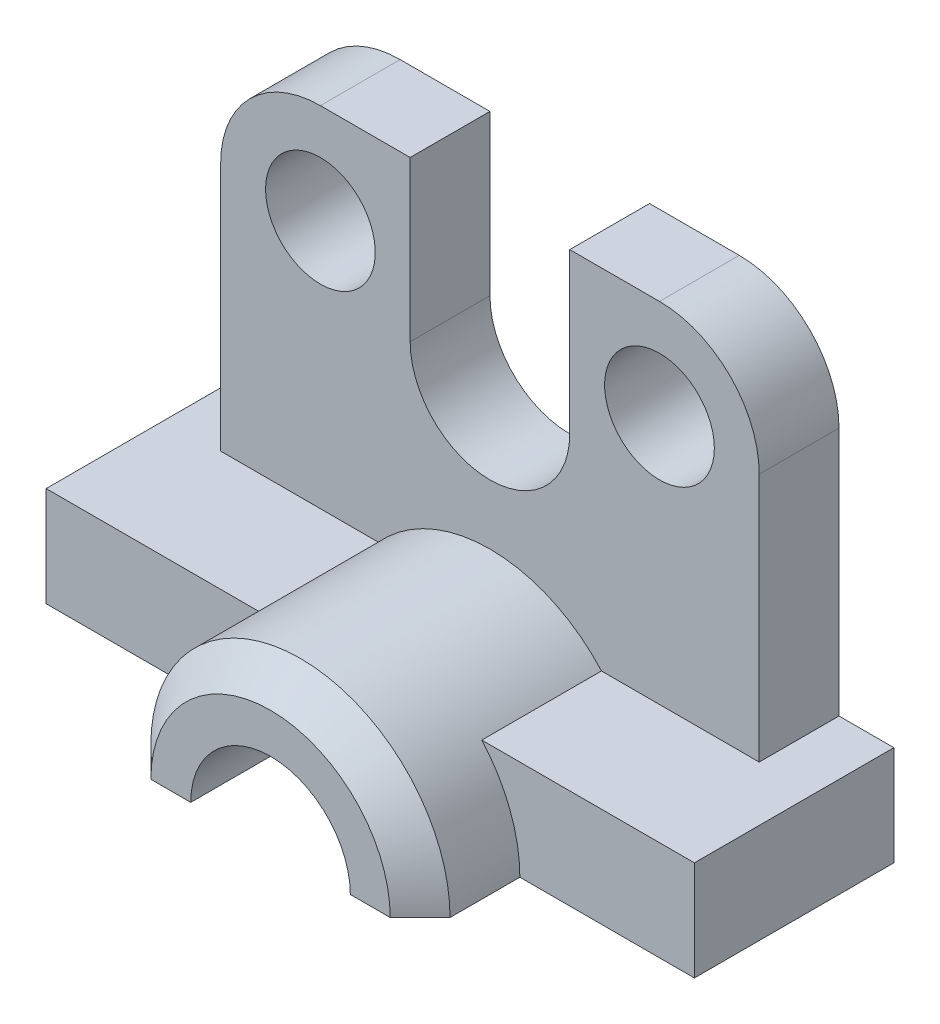
ISO-10303-21;
HEADER;
FILE_DESCRIPTION(('STEP AP214'),'2;1');
FILE_NAME('part.step','',(''),(''),'','','');
FILE_SCHEMA(('AUTOMOTIVE_DESIGN { 1 0 10303 214 1 1 1 1 }'));
ENDSEC;
DATA;
#1=APPLICATION_CONTEXT('core data for automotive mechanical design processes');
#2=APPLICATION_PROTOCOL_DEFINITION('international standard','automotive_design',2000,#1);
#3=PRODUCT_CONTEXT('',#1,'mechanical');
#4=PRODUCT('Part','Part','',(#3));
#5=PRODUCT_RELATED_PRODUCT_CATEGORY('part','',(#4));
#6=PRODUCT_DEFINITION_FORMATION('','',#4);
#7=PRODUCT_DEFINITION_CONTEXT('part definition',#1,'design');
#8=PRODUCT_DEFINITION('design','',#6,#7);
#9=PRODUCT_DEFINITION_SHAPE('','',#8);
#10=(LENGTH_UNIT() NAMED_UNIT(*) SI_UNIT(.MILLI.,.METRE.));
#11=(NAMED_UNIT(*) PLANE_ANGLE_UNIT() SI_UNIT($,.RADIAN.));
#12=(NAMED_UNIT(*) SI_UNIT($,.STERADIAN.) SOLID_ANGLE_UNIT());
#13=UNCERTAINTY_MEASURE_WITH_UNIT(LENGTH_MEASURE(1.E-05),#10,'distance_accuracy_value','');
#14=(GEOMETRIC_REPRESENTATION_CONTEXT(3) GLOBAL_UNCERTAINTY_ASSIGNED_CONTEXT((#13)) GLOBAL_UNIT_ASSIGNED_CONTEXT((#10,
#11,#12)) REPRESENTATION_CONTEXT('',''));
#15=CARTESIAN_POINT('',(0.,0.,0.));
#16=DIRECTION('',(0.,0.,1.));
#17=DIRECTION('',(1.,0.,0.));
#18=AXIS2_PLACEMENT_3D('',#15,#16,#17);
#19=CARTESIAN_POINT('',(0.,0.,30.));
#20=DIRECTION('',(0.,0.,-1.));
#21=DIRECTION('',(-1.,0.,0.));
#22=AXIS2_PLACEMENT_3D('',#19,#20,#21);
#23=PLANE('',#22);
#24=DIRECTION('',(1.,0.,0.));
#25=VECTOR('',#24,1.);
#26=CARTESIAN_POINT('',(7.99999969788877,0.,30.));
#27=LINE('',#26,#25);
#28=CARTESIAN_POINT('',(7.99999969788877,0.,30.));
#29=VERTEX_POINT('',#28);
#30=CARTESIAN_POINT('',(11.9999338015791,0.,30.));
#31=VERTEX_POINT('',#30);
#32=EDGE_CURVE('E281',#29,#31,#27,.T.);
#33=ORIENTED_EDGE('',*,*,#32,.T.);
#34=CARTESIAN_POINT('',(0.,0.,30.));
#35=DIRECTION('',(0.,0.,-1.));
#36=DIRECTION('',(-1.,0.,0.));
#37=AXIS2_PLACEMENT_3D('',#34,#35,#36);
#38=CIRCLE('',#37,11.9999338015791);
#39=CARTESIAN_POINT('',(-11.9999338015791,0.,30.));
#40=VERTEX_POINT('',#39);
#41=EDGE_CURVE('E301',#31,#40,#38,.F.);
#42=ORIENTED_EDGE('',*,*,#41,.T.);
#43=DIRECTION('',(1.,0.,0.));
#44=VECTOR('',#43,1.);
#45=CARTESIAN_POINT('',(-14.9999338015791,0.,30.));
#46=LINE('',#45,#44);
#47=CARTESIAN_POINT('',(-7.99999969788877,0.,30.));
#48=VERTEX_POINT('',#47);
#49=EDGE_CURVE('E273',#40,#48,#46,.T.);
#50=ORIENTED_EDGE('',*,*,#49,.T.);
#51=CARTESIAN_POINT('',(0.,0.,30.));
#52=DIRECTION('',(0.,0.,-1.));
#53=DIRECTION('',(-1.,0.,0.));
#54=AXIS2_PLACEMENT_3D('',#51,#52,#53);
#55=CIRCLE('',#54,7.99999969788877);
#56=EDGE_CURVE('E278',#48,#29,#55,.T.);
#57=ORIENTED_EDGE('',*,*,#56,.T.);
#58=EDGE_LOOP('',(#33,#42,#50,#57));
#59=FACE_BOUND('',#58,.T.);
#60=ADVANCED_FACE('F47',(#59),#23,.F.);
#61=CARTESIAN_POINT('',(-14.9999338015791,0.,30.));
#62=DIRECTION('',(0.,1.,0.));
#63=DIRECTION('',(0.,0.,1.));
#64=AXIS2_PLACEMENT_3D('',#61,#62,#63);
#65=PLANE('',#64);
#66=ORIENTED_EDGE('',*,*,#49,.F.);
#67=DIRECTION('',(0.707106781186546,0.,0.707106781186549));
#68=VECTOR('',#67,1.);
#69=CARTESIAN_POINT('',(0.,0.,41.9999338015792));
#70=LINE('',#69,#68);
#71=CARTESIAN_POINT('',(-14.9999338015791,0.,27.));
#72=VERTEX_POINT('',#71);
#73=EDGE_CURVE('E305',#40,#72,#70,.F.);
#74=ORIENTED_EDGE('',*,*,#73,.T.);
#75=DIRECTION('',(0.,0.,-1.));
#76=VECTOR('',#75,1.);
#77=CARTESIAN_POINT('',(-14.9999338015791,0.,30.));
#78=LINE('',#77,#76);
#79=CARTESIAN_POINT('',(-14.9999338015791,0.,20.));
#80=VERTEX_POINT('',#79);
#81=EDGE_CURVE('E295',#72,#80,#78,.T.);
#82=ORIENTED_EDGE('',*,*,#81,.T.);
#83=DIRECTION('',(1.,0.,0.));
#84=VECTOR('',#83,1.);
#85=CARTESIAN_POINT('',(-32.5,0.,20.));
#86=LINE('',#85,#84);
#87=CARTESIAN_POINT('',(-32.5,0.,20.));
#88=VERTEX_POINT('',#87);
#89=EDGE_CURVE('E258',#88,#80,#86,.T.);
#90=ORIENTED_EDGE('',*,*,#89,.F.);
#91=DIRECTION('',(0.,0.,1.));
#92=VECTOR('',#91,1.);
#93=CARTESIAN_POINT('',(-32.5,0.,0.));
#94=LINE('',#93,#92);
#95=CARTESIAN_POINT('',(-32.5,0.,0.));
#96=VERTEX_POINT('',#95);
#97=EDGE_CURVE('E254',#96,#88,#94,.T.);
#98=ORIENTED_EDGE('',*,*,#97,.F.);
#99=DIRECTION('',(-1.,0.,0.));
#100=VECTOR('',#99,1.);
#101=CARTESIAN_POINT('',(-32.5,0.,0.));
#102=LINE('',#101,#100);
#103=CARTESIAN_POINT('',(-7.99999969788877,0.,0.));
#104=VERTEX_POINT('',#103);
#105=EDGE_CURVE('E257',#104,#96,#102,.T.);
#106=ORIENTED_EDGE('',*,*,#105,.F.);
#107=DIRECTION('',(0.,0.,-1.));
#108=VECTOR('',#107,1.);
#109=CARTESIAN_POINT('',(-7.99999969788877,0.,30.));
#110=LINE('',#109,#108);
#111=EDGE_CURVE('E292',#48,#104,#110,.T.);
#112=ORIENTED_EDGE('',*,*,#111,.F.);
#113=EDGE_LOOP('',(#66,#74,#82,#90,#98,#106,#112));
#114=FACE_BOUND('',#113,.T.);
#115=ADVANCED_FACE('F465',(#114),#65,.F.);
#116=CARTESIAN_POINT('',(0.,0.,0.));
#117=DIRECTION('',(0.,0.,-1.));
#118=DIRECTION('',(-1.,0.,0.));
#119=AXIS2_PLACEMENT_3D('',#116,#117,#118);
#120=PLANE('',#119);
#121=DIRECTION('',(-1.,0.,0.));
#122=VECTOR('',#121,1.);
#123=CARTESIAN_POINT('',(-32.5,10.,0.));
#124=LINE('',#123,#122);
#125=CARTESIAN_POINT('',(-27.,10.,0.));
#126=VERTEX_POINT('',#125);
#127=CARTESIAN_POINT('',(-32.5,10.,0.));
#128=VERTEX_POINT('',#127);
#129=EDGE_CURVE('E262',#126,#128,#124,.T.);
#130=ORIENTED_EDGE('',*,*,#129,.F.);
#131=DIRECTION('',(0.,-1.,0.));
#132=VECTOR('',#131,1.);
#133=CARTESIAN_POINT('',(-27.,10.,0.));
#134=LINE('',#133,#132);
#135=CARTESIAN_POINT('',(-27.,35.,0.));
#136=VERTEX_POINT('',#135);
#137=EDGE_CURVE('E202',#136,#126,#134,.T.);
#138=ORIENTED_EDGE('',*,*,#137,.F.);
#139=CARTESIAN_POINT('',(-17.,35.,0.));
#140=DIRECTION('',(0.,0.,1.));
#141=DIRECTION('',(-1.,0.,0.));
#142=AXIS2_PLACEMENT_3D('',#139,#140,#141);
#143=CIRCLE('',#142,10.);
#144=CARTESIAN_POINT('',(-17.,45.,0.));
#145=VERTEX_POINT('',#144);
#146=EDGE_CURVE('E362',#145,#136,#143,.T.);
#147=ORIENTED_EDGE('',*,*,#146,.F.);
#148=DIRECTION('',(-1.,0.,0.));
#149=VECTOR('',#148,1.);
#150=CARTESIAN_POINT('',(-17.,45.,0.));
#151=LINE('',#150,#149);
#152=CARTESIAN_POINT('',(-8.,45.,0.));
#153=VERTEX_POINT('',#152);
#154=EDGE_CURVE('E365',#153,#145,#151,.T.);
#155=ORIENTED_EDGE('',*,*,#154,.F.);
#156=DIRECTION('',(0.,1.,0.));
#157=VECTOR('',#156,1.);
#158=CARTESIAN_POINT('',(-8.,45.,0.));
#159=LINE('',#158,#157);
#160=CARTESIAN_POINT('',(-8.,29.,0.));
#161=VERTEX_POINT('',#160);
#162=EDGE_CURVE('E368',#161,#153,#159,.T.);
#163=ORIENTED_EDGE('',*,*,#162,.F.);
#164=CARTESIAN_POINT('',(0.,29.,0.));
#165=DIRECTION('',(0.,0.,-1.));
#166=DIRECTION('',(1.,0.,0.));
#167=AXIS2_PLACEMENT_3D('',#164,#165,#166);
#168=CIRCLE('',#167,8.);
#169=CARTESIAN_POINT('',(8.,29.,0.));
#170=VERTEX_POINT('',#169);
#171=EDGE_CURVE('E371',#170,#161,#168,.T.);
#172=ORIENTED_EDGE('',*,*,#171,.F.);
#173=DIRECTION('',(0.,-1.,0.));
#174=VECTOR('',#173,1.);
#175=CARTESIAN_POINT('',(8.,45.,0.));
#176=LINE('',#175,#174);
#177=CARTESIAN_POINT('',(8.,45.,0.));
#178=VERTEX_POINT('',#177);
#179=EDGE_CURVE('E374',#178,#170,#176,.T.);
#180=ORIENTED_EDGE('',*,*,#179,.F.);
#181=DIRECTION('',(-1.,0.,0.));
#182=VECTOR('',#181,1.);
#183=CARTESIAN_POINT('',(17.,45.,0.));
#184=LINE('',#183,#182);
#185=CARTESIAN_POINT('',(17.,45.,0.));
#186=VERTEX_POINT('',#185);
#187=EDGE_CURVE('E377',#186,#178,#184,.T.);
#188=ORIENTED_EDGE('',*,*,#187,.F.);
#189=CARTESIAN_POINT('',(17.,35.,0.));
#190=DIRECTION('',(0.,0.,1.));
#191=DIRECTION('',(1.,0.,0.));
#192=AXIS2_PLACEMENT_3D('',#189,#190,#191);
#193=CIRCLE('',#192,10.);
#194=CARTESIAN_POINT('',(27.,35.,0.));
#195=VERTEX_POINT('',#194);
#196=EDGE_CURVE('E380',#195,#186,#193,.T.);
#197=ORIENTED_EDGE('',*,*,#196,.F.);
#198=DIRECTION('',(0.,1.,0.));
#199=VECTOR('',#198,1.);
#200=CARTESIAN_POINT('',(27.,10.,0.));
#201=LINE('',#200,#199);
#202=CARTESIAN_POINT('',(27.,10.,0.));
#203=VERTEX_POINT('',#202);
#204=EDGE_CURVE('E383',#203,#195,#201,.T.);
#205=ORIENTED_EDGE('',*,*,#204,.F.);
#206=DIRECTION('',(-1.,0.,0.));
#207=VECTOR('',#206,1.);
#208=CARTESIAN_POINT('',(-32.5,10.,0.));
#209=LINE('',#208,#207);
#210=CARTESIAN_POINT('',(32.5,10.,0.));
#211=VERTEX_POINT('',#210);
#212=EDGE_CURVE('E236',#211,#203,#209,.T.);
#213=ORIENTED_EDGE('',*,*,#212,.F.);
#214=DIRECTION('',(0.,-1.,0.));
#215=VECTOR('',#214,1.);
#216=CARTESIAN_POINT('',(32.5,10.,0.));
#217=LINE('',#216,#215);
#218=CARTESIAN_POINT('',(32.5,0.,0.));
#219=VERTEX_POINT('',#218);
#220=EDGE_CURVE('E217',#211,#219,#217,.T.);
#221=ORIENTED_EDGE('',*,*,#220,.T.);
#222=DIRECTION('',(-1.,0.,0.));
#223=VECTOR('',#222,1.);
#224=CARTESIAN_POINT('',(-32.5,0.,0.));
#225=LINE('',#224,#223);
#226=CARTESIAN_POINT('',(7.99999969788877,0.,0.));
#227=VERTEX_POINT('',#226);
#228=EDGE_CURVE('E231',#219,#227,#225,.T.);
#229=ORIENTED_EDGE('',*,*,#228,.T.);
#230=CARTESIAN_POINT('',(0.,0.,0.));
#231=DIRECTION('',(0.,0.,-1.));
#232=DIRECTION('',(-1.,0.,0.));
#233=AXIS2_PLACEMENT_3D('',#230,#231,#232);
#234=CIRCLE('',#233,7.99999969788877);
#235=EDGE_CURVE('E218',#104,#227,#234,.T.);
#236=ORIENTED_EDGE('',*,*,#235,.F.);
#237=ORIENTED_EDGE('',*,*,#105,.T.);
#238=DIRECTION('',(0.,-1.,0.));
#239=VECTOR('',#238,1.);
#240=CARTESIAN_POINT('',(-32.5,10.,0.));
#241=LINE('',#240,#239);
#242=EDGE_CURVE('E244',#128,#96,#241,.T.);
#243=ORIENTED_EDGE('',*,*,#242,.F.);
#244=EDGE_LOOP('',(#130,#138,#147,#155,#163,#172,#180,#188,#197,#205,#213,#221,#229,#236,#237,#243));
#245=FACE_BOUND('',#244,.T.);
#246=CARTESIAN_POINT('',(17.,35.,0.));
#247=DIRECTION('',(0.,0.,1.));
#248=DIRECTION('',(1.,0.,0.));
#249=AXIS2_PLACEMENT_3D('',#246,#247,#248);
#250=CIRCLE('',#249,5.5);
#251=CARTESIAN_POINT('',(22.5,35.,0.));
#252=VERTEX_POINT('',#251);
#253=EDGE_CURVE('E415',#252,#252,#250,.T.);
#254=ORIENTED_EDGE('',*,*,#253,.T.);
#255=EDGE_LOOP('',(#254));
#256=FACE_BOUND('',#255,.T.);
#257=CARTESIAN_POINT('',(-17.,35.,0.));
#258=DIRECTION('',(0.,0.,1.));
#259=DIRECTION('',(-1.,0.,0.));
#260=AXIS2_PLACEMENT_3D('',#257,#258,#259);
#261=CIRCLE('',#260,5.5);
#262=CARTESIAN_POINT('',(-22.5,35.,0.));
#263=VERTEX_POINT('',#262);
#264=EDGE_CURVE('E423',#263,#263,#261,.T.);
#265=ORIENTED_EDGE('',*,*,#264,.T.);
#266=EDGE_LOOP('',(#265));
#267=FACE_BOUND('',#266,.T.);
#268=ADVANCED_FACE('F467',(#245,#256,#267),#120,.T.);
#269=CARTESIAN_POINT('',(7.99999969788877,0.,30.));
#270=DIRECTION('',(0.,1.,0.));
#271=DIRECTION('',(0.,0.,1.));
#272=AXIS2_PLACEMENT_3D('',#269,#270,#271);
#273=PLANE('',#272);
#274=DIRECTION('',(0.,0.,-1.));
#275=VECTOR('',#274,1.);
#276=CARTESIAN_POINT('',(14.9999338015791,0.,30.));
#277=LINE('',#276,#275);
#278=CARTESIAN_POINT('',(14.9999338015791,0.,27.));
#279=VERTEX_POINT('',#278);
#280=CARTESIAN_POINT('',(14.9999338015791,0.,20.));
#281=VERTEX_POINT('',#280);
#282=EDGE_CURVE('E285',#279,#281,#277,.T.);
#283=ORIENTED_EDGE('',*,*,#282,.F.);
#284=DIRECTION('',(0.707106781186546,0.,-0.707106781186549));
#285=VECTOR('',#284,1.);
#286=CARTESIAN_POINT('',(0.,0.,41.9999338015792));
#287=LINE('',#286,#285);
#288=EDGE_CURVE('E11',#279,#31,#287,.F.);
#289=ORIENTED_EDGE('',*,*,#288,.T.);
#290=ORIENTED_EDGE('',*,*,#32,.F.);
#291=DIRECTION('',(0.,0.,-1.));
#292=VECTOR('',#291,1.);
#293=CARTESIAN_POINT('',(7.99999969788877,0.,30.));
#294=LINE('',#293,#292);
#295=EDGE_CURVE('E288',#29,#227,#294,.T.);
#296=ORIENTED_EDGE('',*,*,#295,.T.);
#297=ORIENTED_EDGE('',*,*,#228,.F.);
#298=DIRECTION('',(0.,0.,-1.));
#299=VECTOR('',#298,1.);
#300=CARTESIAN_POINT('',(32.5,0.,0.));
#301=LINE('',#300,#299);
#302=CARTESIAN_POINT('',(32.5,0.,20.));
#303=VERTEX_POINT('',#302);
#304=EDGE_CURVE('E234',#303,#219,#301,.T.);
#305=ORIENTED_EDGE('',*,*,#304,.F.);
#306=DIRECTION('',(1.,0.,0.));
#307=VECTOR('',#306,1.);
#308=CARTESIAN_POINT('',(-32.5,0.,20.));
#309=LINE('',#308,#307);
#310=EDGE_CURVE('E235',#281,#303,#309,.T.);
#311=ORIENTED_EDGE('',*,*,#310,.F.);
#312=EDGE_LOOP('',(#283,#289,#290,#296,#297,#305,#311));
#313=FACE_BOUND('',#312,.T.);
#314=ADVANCED_FACE('F461',(#313),#273,.F.);
#315=CARTESIAN_POINT('',(0.,0.,30.));
#316=DIRECTION('',(0.,0.,-1.));
#317=DIRECTION('',(-1.,0.,0.));
#318=AXIS2_PLACEMENT_3D('',#315,#316,#317);
#319=CYLINDRICAL_SURFACE('',#318,14.9999338015791);
#320=DIRECTION('',(0.,0.,-1.));
#321=VECTOR('',#320,1.);
#322=CARTESIAN_POINT('',(11.1802510728407,10.,30.));
#323=LINE('',#322,#321);
#324=CARTESIAN_POINT('',(11.1802510728407,10.,8.));
#325=VERTEX_POINT('',#324);
#326=CARTESIAN_POINT('',(11.1802510728407,10.,20.));
#327=VERTEX_POINT('',#326);
#328=EDGE_CURVE('E206',#325,#327,#323,.F.);
#329=ORIENTED_EDGE('',*,*,#328,.F.);
#330=CARTESIAN_POINT('',(0.,0.,8.));
#331=DIRECTION('',(0.,0.,-1.));
#332=DIRECTION('',(1.,0.,0.));
#333=AXIS2_PLACEMENT_3D('',#330,#331,#332);
#334=CIRCLE('',#333,14.9999338015791);
#335=CARTESIAN_POINT('',(-11.1802510728408,9.99999999999992,8.));
#336=VERTEX_POINT('',#335);
#337=EDGE_CURVE('E190',#336,#325,#334,.T.);
#338=ORIENTED_EDGE('',*,*,#337,.F.);
#339=DIRECTION('',(0.,0.,-1.));
#340=VECTOR('',#339,1.);
#341=CARTESIAN_POINT('',(-11.1802510728407,10.,30.));
#342=LINE('',#341,#340);
#343=CARTESIAN_POINT('',(-11.1802510728407,10.,20.));
#344=VERTEX_POINT('',#343);
#345=EDGE_CURVE('E249',#344,#336,#342,.T.);
#346=ORIENTED_EDGE('',*,*,#345,.F.);
#347=CARTESIAN_POINT('',(0.,0.,20.));
#348=DIRECTION('',(0.,0.,-1.));
#349=DIRECTION('',(-1.,0.,0.));
#350=AXIS2_PLACEMENT_3D('',#347,#348,#349);
#351=CIRCLE('',#350,14.9999338015791);
#352=EDGE_CURVE('E298',#344,#80,#351,.F.);
#353=ORIENTED_EDGE('',*,*,#352,.T.);
#354=ORIENTED_EDGE('',*,*,#81,.F.);
#355=CARTESIAN_POINT('',(0.,0.,27.));
#356=DIRECTION('',(0.,0.,-1.));
#357=DIRECTION('',(-1.,0.,0.));
#358=AXIS2_PLACEMENT_3D('',#355,#356,#357);
#359=CIRCLE('',#358,14.9999338015791);
#360=EDGE_CURVE('E57',#72,#279,#359,.T.);
#361=ORIENTED_EDGE('',*,*,#360,.T.);
#362=ORIENTED_EDGE('',*,*,#282,.T.);
#363=EDGE_CURVE('E215',#281,#327,#351,.F.);
#364=ORIENTED_EDGE('',*,*,#363,.T.);
#365=EDGE_LOOP('',(#329,#338,#346,#353,#354,#361,#362,#364));
#366=FACE_BOUND('',#365,.T.);
#367=ADVANCED_FACE('F213',(#366),#319,.T.);
#368=CARTESIAN_POINT('',(0.,0.,30.));
#369=DIRECTION('',(0.,0.,-1.));
#370=DIRECTION('',(-1.,0.,0.));
#371=AXIS2_PLACEMENT_3D('',#368,#369,#370);
#372=CYLINDRICAL_SURFACE('',#371,7.99999969788877);
#373=ORIENTED_EDGE('',*,*,#111,.T.);
#374=ORIENTED_EDGE('',*,*,#235,.T.);
#375=ORIENTED_EDGE('',*,*,#295,.F.);
#376=ORIENTED_EDGE('',*,*,#56,.F.);
#377=EDGE_LOOP('',(#373,#374,#375,#376));
#378=FACE_BOUND('',#377,.T.);
#379=ADVANCED_FACE('F449',(#378),#372,.F.);
#380=CARTESIAN_POINT('',(-32.5,10.,0.));
#381=DIRECTION('',(1.,0.,0.));
#382=DIRECTION('',(0.,0.,-1.));
#383=AXIS2_PLACEMENT_3D('',#380,#381,#382);
#384=PLANE('',#383);
#385=ORIENTED_EDGE('',*,*,#97,.T.);
#386=DIRECTION('',(0.,-1.,0.));
#387=VECTOR('',#386,1.);
#388=CARTESIAN_POINT('',(-32.5,10.,20.));
#389=LINE('',#388,#387);
#390=CARTESIAN_POINT('',(-32.5,10.,20.));
#391=VERTEX_POINT('',#390);
#392=EDGE_CURVE('E248',#391,#88,#389,.T.);
#393=ORIENTED_EDGE('',*,*,#392,.F.);
#394=DIRECTION('',(0.,0.,1.));
#395=VECTOR('',#394,1.);
#396=CARTESIAN_POINT('',(-32.5,10.,0.));
#397=LINE('',#396,#395);
#398=EDGE_CURVE('E259',#128,#391,#397,.T.);
#399=ORIENTED_EDGE('',*,*,#398,.F.);
#400=ORIENTED_EDGE('',*,*,#242,.T.);
#401=EDGE_LOOP('',(#385,#393,#399,#400));
#402=FACE_BOUND('',#401,.T.);
#403=ADVANCED_FACE('F451',(#402),#384,.F.);
#404=CARTESIAN_POINT('',(-32.5,10.,20.));
#405=DIRECTION('',(0.,0.,-1.));
#406=DIRECTION('',(-1.,0.,0.));
#407=AXIS2_PLACEMENT_3D('',#404,#405,#406);
#408=PLANE('',#407);
#409=ORIENTED_EDGE('',*,*,#352,.F.);
#410=DIRECTION('',(1.,0.,0.));
#411=VECTOR('',#410,1.);
#412=CARTESIAN_POINT('',(-32.5,10.,20.));
#413=LINE('',#412,#411);
#414=EDGE_CURVE('E253',#391,#344,#413,.T.);
#415=ORIENTED_EDGE('',*,*,#414,.F.);
#416=ORIENTED_EDGE('',*,*,#392,.T.);
#417=ORIENTED_EDGE('',*,*,#89,.T.);
#418=EDGE_LOOP('',(#409,#415,#416,#417));
#419=FACE_BOUND('',#418,.T.);
#420=ADVANCED_FACE('F457',(#419),#408,.F.);
#421=CARTESIAN_POINT('',(0.,10.,0.));
#422=DIRECTION('',(0.,1.,0.));
#423=DIRECTION('',(0.,0.,1.));
#424=AXIS2_PLACEMENT_3D('',#421,#422,#423);
#425=PLANE('',#424);
#426=DIRECTION('',(1.,0.,0.));
#427=VECTOR('',#426,1.);
#428=CARTESIAN_POINT('',(-11.1802510728408,9.99999999999992,8.));
#429=LINE('',#428,#427);
#430=CARTESIAN_POINT('',(-27.,10.,8.));
#431=VERTEX_POINT('',#430);
#432=EDGE_CURVE('E197',#431,#336,#429,.T.);
#433=ORIENTED_EDGE('',*,*,#432,.F.);
#434=DIRECTION('',(0.,0.,-1.));
#435=VECTOR('',#434,1.);
#436=CARTESIAN_POINT('',(-27.,10.,8.));
#437=LINE('',#436,#435);
#438=EDGE_CURVE('E356',#431,#126,#437,.T.);
#439=ORIENTED_EDGE('',*,*,#438,.T.);
#440=ORIENTED_EDGE('',*,*,#129,.T.);
#441=ORIENTED_EDGE('',*,*,#398,.T.);
#442=ORIENTED_EDGE('',*,*,#414,.T.);
#443=ORIENTED_EDGE('',*,*,#345,.T.);
#444=EDGE_LOOP('',(#433,#439,#440,#441,#442,#443));
#445=FACE_BOUND('',#444,.T.);
#446=ADVANCED_FACE('F477',(#445),#425,.T.);
#447=CARTESIAN_POINT('',(32.5,10.,0.));
#448=DIRECTION('',(-1.,0.,0.));
#449=DIRECTION('',(0.,0.,1.));
#450=AXIS2_PLACEMENT_3D('',#447,#448,#449);
#451=PLANE('',#450);
#452=ORIENTED_EDGE('',*,*,#304,.T.);
#453=ORIENTED_EDGE('',*,*,#220,.F.);
#454=DIRECTION('',(0.,0.,-1.));
#455=VECTOR('',#454,1.);
#456=CARTESIAN_POINT('',(32.5,10.,0.));
#457=LINE('',#456,#455);
#458=CARTESIAN_POINT('',(32.5,10.,20.));
#459=VERTEX_POINT('',#458);
#460=EDGE_CURVE('E229',#459,#211,#457,.T.);
#461=ORIENTED_EDGE('',*,*,#460,.F.);
#462=DIRECTION('',(0.,-1.,0.));
#463=VECTOR('',#462,1.);
#464=CARTESIAN_POINT('',(32.5,10.,20.));
#465=LINE('',#464,#463);
#466=EDGE_CURVE('E223',#459,#303,#465,.T.);
#467=ORIENTED_EDGE('',*,*,#466,.T.);
#468=EDGE_LOOP('',(#452,#453,#461,#467));
#469=FACE_BOUND('',#468,.T.);
#470=ADVANCED_FACE('F445',(#469),#451,.F.);
#471=CARTESIAN_POINT('',(-32.5,10.,20.));
#472=DIRECTION('',(0.,0.,-1.));
#473=DIRECTION('',(-1.,0.,0.));
#474=AXIS2_PLACEMENT_3D('',#471,#472,#473);
#475=PLANE('',#474);
#476=ORIENTED_EDGE('',*,*,#363,.F.);
#477=ORIENTED_EDGE('',*,*,#310,.T.);
#478=ORIENTED_EDGE('',*,*,#466,.F.);
#479=DIRECTION('',(1.,0.,0.));
#480=VECTOR('',#479,1.);
#481=CARTESIAN_POINT('',(-32.5,10.,20.));
#482=LINE('',#481,#480);
#483=EDGE_CURVE('E239',#327,#459,#482,.T.);
#484=ORIENTED_EDGE('',*,*,#483,.F.);
#485=EDGE_LOOP('',(#476,#477,#478,#484));
#486=FACE_BOUND('',#485,.T.);
#487=ADVANCED_FACE('F489',(#486),#475,.F.);
#488=CARTESIAN_POINT('',(0.,10.,0.));
#489=DIRECTION('',(0.,1.,0.));
#490=DIRECTION('',(0.,0.,1.));
#491=AXIS2_PLACEMENT_3D('',#488,#489,#490);
#492=PLANE('',#491);
#493=DIRECTION('',(1.,0.,0.));
#494=VECTOR('',#493,1.);
#495=CARTESIAN_POINT('',(11.1802510728407,10.,8.));
#496=LINE('',#495,#494);
#497=CARTESIAN_POINT('',(27.,10.,8.));
#498=VERTEX_POINT('',#497);
#499=EDGE_CURVE('E194',#325,#498,#496,.T.);
#500=ORIENTED_EDGE('',*,*,#499,.F.);
#501=ORIENTED_EDGE('',*,*,#328,.T.);
#502=ORIENTED_EDGE('',*,*,#483,.T.);
#503=ORIENTED_EDGE('',*,*,#460,.T.);
#504=ORIENTED_EDGE('',*,*,#212,.T.);
#505=DIRECTION('',(0.,0.,-1.));
#506=VECTOR('',#505,1.);
#507=CARTESIAN_POINT('',(27.,10.,8.));
#508=LINE('',#507,#506);
#509=EDGE_CURVE('E209',#498,#203,#508,.T.);
#510=ORIENTED_EDGE('',*,*,#509,.F.);
#511=EDGE_LOOP('',(#500,#501,#502,#503,#504,#510));
#512=FACE_BOUND('',#511,.T.);
#513=ADVANCED_FACE('F205',(#512),#492,.T.);
#514=CARTESIAN_POINT('',(0.,0.,30.));
#515=DIRECTION('',(0.,0.,-1.));
#516=DIRECTION('',(-1.,0.,0.));
#517=AXIS2_PLACEMENT_3D('',#514,#515,#516);
#518=CONICAL_SURFACE('',#517,11.9999338015791,0.785398163397446);
#519=ORIENTED_EDGE('',*,*,#288,.F.);
#520=ORIENTED_EDGE('',*,*,#360,.F.);
#521=ORIENTED_EDGE('',*,*,#73,.F.);
#522=ORIENTED_EDGE('',*,*,#41,.F.);
#523=EDGE_LOOP('',(#519,#520,#521,#522));
#524=FACE_BOUND('',#523,.T.);
#525=ADVANCED_FACE('F50',(#524),#518,.T.);
#526=CARTESIAN_POINT('',(0.,0.,8.));
#527=DIRECTION('',(0.,0.,1.));
#528=DIRECTION('',(1.,0.,0.));
#529=AXIS2_PLACEMENT_3D('',#526,#527,#528);
#530=PLANE('',#529);
#531=CARTESIAN_POINT('',(17.,35.,8.));
#532=DIRECTION('',(0.,0.,1.));
#533=DIRECTION('',(1.,0.,0.));
#534=AXIS2_PLACEMENT_3D('',#531,#532,#533);
#535=CIRCLE('',#534,5.5);
#536=CARTESIAN_POINT('',(22.5,35.,8.));
#537=VERTEX_POINT('',#536);
#538=EDGE_CURVE('E386',#537,#537,#535,.T.);
#539=ORIENTED_EDGE('',*,*,#538,.F.);
#540=EDGE_LOOP('',(#539));
#541=FACE_BOUND('',#540,.T.);
#542=ORIENTED_EDGE('',*,*,#337,.T.);
#543=ORIENTED_EDGE('',*,*,#499,.T.);
#544=DIRECTION('',(0.,1.,0.));
#545=VECTOR('',#544,1.);
#546=CARTESIAN_POINT('',(27.,10.,8.));
#547=LINE('',#546,#545);
#548=CARTESIAN_POINT('',(27.,35.,8.));
#549=VERTEX_POINT('',#548);
#550=EDGE_CURVE('E64',#498,#549,#547,.T.);
#551=ORIENTED_EDGE('',*,*,#550,.T.);
#552=CARTESIAN_POINT('',(17.,35.,8.));
#553=DIRECTION('',(0.,0.,1.));
#554=DIRECTION('',(1.,0.,0.));
#555=AXIS2_PLACEMENT_3D('',#552,#553,#554);
#556=CIRCLE('',#555,10.);
#557=CARTESIAN_POINT('',(17.,45.,8.));
#558=VERTEX_POINT('',#557);
#559=EDGE_CURVE('E410',#549,#558,#556,.T.);
#560=ORIENTED_EDGE('',*,*,#559,.T.);
#561=DIRECTION('',(-1.,0.,0.));
#562=VECTOR('',#561,1.);
#563=CARTESIAN_POINT('',(17.,45.,8.));
#564=LINE('',#563,#562);
#565=CARTESIAN_POINT('',(8.,45.,8.));
#566=VERTEX_POINT('',#565);
#567=EDGE_CURVE('E407',#558,#566,#564,.T.);
#568=ORIENTED_EDGE('',*,*,#567,.T.);
#569=DIRECTION('',(0.,-1.,0.));
#570=VECTOR('',#569,1.);
#571=CARTESIAN_POINT('',(8.,45.,8.));
#572=LINE('',#571,#570);
#573=CARTESIAN_POINT('',(8.,29.,8.));
#574=VERTEX_POINT('',#573);
#575=EDGE_CURVE('E404',#566,#574,#572,.T.);
#576=ORIENTED_EDGE('',*,*,#575,.T.);
#577=CARTESIAN_POINT('',(0.,29.,8.));
#578=DIRECTION('',(0.,0.,-1.));
#579=DIRECTION('',(1.,0.,0.));
#580=AXIS2_PLACEMENT_3D('',#577,#578,#579);
#581=CIRCLE('',#580,8.);
#582=CARTESIAN_POINT('',(-8.,29.,8.));
#583=VERTEX_POINT('',#582);
#584=EDGE_CURVE('E401',#574,#583,#581,.T.);
#585=ORIENTED_EDGE('',*,*,#584,.T.);
#586=DIRECTION('',(0.,1.,0.));
#587=VECTOR('',#586,1.);
#588=CARTESIAN_POINT('',(-8.,45.,8.));
#589=LINE('',#588,#587);
#590=CARTESIAN_POINT('',(-8.,45.,8.));
#591=VERTEX_POINT('',#590);
#592=EDGE_CURVE('E398',#583,#591,#589,.T.);
#593=ORIENTED_EDGE('',*,*,#592,.T.);
#594=DIRECTION('',(-1.,0.,0.));
#595=VECTOR('',#594,1.);
#596=CARTESIAN_POINT('',(-17.,45.,8.));
#597=LINE('',#596,#595);
#598=CARTESIAN_POINT('',(-17.,45.,8.));
#599=VERTEX_POINT('',#598);
#600=EDGE_CURVE('E395',#591,#599,#597,.T.);
#601=ORIENTED_EDGE('',*,*,#600,.T.);
#602=CARTESIAN_POINT('',(-17.,35.,8.));
#603=DIRECTION('',(0.,0.,1.));
#604=DIRECTION('',(-1.,0.,0.));
#605=AXIS2_PLACEMENT_3D('',#602,#603,#604);
#606=CIRCLE('',#605,10.);
#607=CARTESIAN_POINT('',(-27.,35.,8.));
#608=VERTEX_POINT('',#607);
#609=EDGE_CURVE('E392',#599,#608,#606,.T.);
#610=ORIENTED_EDGE('',*,*,#609,.T.);
#611=DIRECTION('',(0.,-1.,0.));
#612=VECTOR('',#611,1.);
#613=CARTESIAN_POINT('',(-27.,10.,8.));
#614=LINE('',#613,#612);
#615=EDGE_CURVE('E389',#608,#431,#614,.T.);
#616=ORIENTED_EDGE('',*,*,#615,.T.);
#617=ORIENTED_EDGE('',*,*,#432,.T.);
#618=EDGE_LOOP('',(#542,#543,#551,#560,#568,#576,#585,#593,#601,#610,#616,#617));
#619=FACE_BOUND('',#618,.T.);
#620=CARTESIAN_POINT('',(-17.,35.,8.));
#621=DIRECTION('',(0.,0.,1.));
#622=DIRECTION('',(-1.,0.,0.));
#623=AXIS2_PLACEMENT_3D('',#620,#621,#622);
#624=CIRCLE('',#623,5.5);
#625=CARTESIAN_POINT('',(-22.5,35.,8.));
#626=VERTEX_POINT('',#625);
#627=EDGE_CURVE('E419',#626,#626,#624,.T.);
#628=ORIENTED_EDGE('',*,*,#627,.F.);
#629=EDGE_LOOP('',(#628));
#630=FACE_BOUND('',#629,.T.);
#631=ADVANCED_FACE('F192',(#541,#619,#630),#530,.T.);
#632=CARTESIAN_POINT('',(27.,10.,8.));
#633=DIRECTION('',(-1.,0.,0.));
#634=DIRECTION('',(0.,0.,1.));
#635=AXIS2_PLACEMENT_3D('',#632,#633,#634);
#636=PLANE('',#635);
#637=ORIENTED_EDGE('',*,*,#204,.T.);
#638=DIRECTION('',(0.,0.,-1.));
#639=VECTOR('',#638,1.);
#640=CARTESIAN_POINT('',(27.,35.,8.));
#641=LINE('',#640,#639);
#642=EDGE_CURVE('E324',#549,#195,#641,.T.);
#643=ORIENTED_EDGE('',*,*,#642,.F.);
#644=ORIENTED_EDGE('',*,*,#550,.F.);
#645=ORIENTED_EDGE('',*,*,#509,.T.);
#646=EDGE_LOOP('',(#637,#643,#644,#645));
#647=FACE_BOUND('',#646,.T.);
#648=ADVANCED_FACE('F434',(#647),#636,.F.);
#649=CARTESIAN_POINT('',(17.,35.,8.));
#650=DIRECTION('',(0.,0.,-1.));
#651=DIRECTION('',(-1.,0.,0.));
#652=AXIS2_PLACEMENT_3D('',#649,#650,#651);
#653=CYLINDRICAL_SURFACE('',#652,10.);
#654=ORIENTED_EDGE('',*,*,#196,.T.);
#655=DIRECTION('',(0.,0.,-1.));
#656=VECTOR('',#655,1.);
#657=CARTESIAN_POINT('',(17.,45.,8.));
#658=LINE('',#657,#656);
#659=EDGE_CURVE('E328',#558,#186,#658,.T.);
#660=ORIENTED_EDGE('',*,*,#659,.F.);
#661=ORIENTED_EDGE('',*,*,#559,.F.);
#662=ORIENTED_EDGE('',*,*,#642,.T.);
#663=EDGE_LOOP('',(#654,#660,#661,#662));
#664=FACE_BOUND('',#663,.T.);
#665=ADVANCED_FACE('F441',(#664),#653,.T.);
#666=CARTESIAN_POINT('',(17.,45.,8.));
#667=DIRECTION('',(0.,-1.,0.));
#668=DIRECTION('',(0.,0.,-1.));
#669=AXIS2_PLACEMENT_3D('',#666,#667,#668);
#670=PLANE('',#669);
#671=ORIENTED_EDGE('',*,*,#187,.T.);
#672=DIRECTION('',(0.,0.,-1.));
#673=VECTOR('',#672,1.);
#674=CARTESIAN_POINT('',(8.,45.,8.));
#675=LINE('',#674,#673);
#676=EDGE_CURVE('E332',#566,#178,#675,.T.);
#677=ORIENTED_EDGE('',*,*,#676,.F.);
#678=ORIENTED_EDGE('',*,*,#567,.F.);
#679=ORIENTED_EDGE('',*,*,#659,.T.);
#680=EDGE_LOOP('',(#671,#677,#678,#679));
#681=FACE_BOUND('',#680,.T.);
#682=ADVANCED_FACE('F505',(#681),#670,.F.);
#683=CARTESIAN_POINT('',(8.,45.,8.));
#684=DIRECTION('',(1.,0.,0.));
#685=DIRECTION('',(0.,1.,0.));
#686=AXIS2_PLACEMENT_3D('',#683,#684,#685);
#687=PLANE('',#686);
#688=ORIENTED_EDGE('',*,*,#179,.T.);
#689=DIRECTION('',(0.,0.,-1.));
#690=VECTOR('',#689,1.);
#691=CARTESIAN_POINT('',(8.,29.,8.));
#692=LINE('',#691,#690);
#693=EDGE_CURVE('E336',#574,#170,#692,.T.);
#694=ORIENTED_EDGE('',*,*,#693,.F.);
#695=ORIENTED_EDGE('',*,*,#575,.F.);
#696=ORIENTED_EDGE('',*,*,#676,.T.);
#697=EDGE_LOOP('',(#688,#694,#695,#696));
#698=FACE_BOUND('',#697,.T.);
#699=ADVANCED_FACE('F508',(#698),#687,.F.);
#700=CARTESIAN_POINT('',(0.,29.,8.));
#701=DIRECTION('',(0.,0.,-1.));
#702=DIRECTION('',(-1.,0.,0.));
#703=AXIS2_PLACEMENT_3D('',#700,#701,#702);
#704=CYLINDRICAL_SURFACE('',#703,8.);
#705=ORIENTED_EDGE('',*,*,#171,.T.);
#706=DIRECTION('',(0.,0.,-1.));
#707=VECTOR('',#706,1.);
#708=CARTESIAN_POINT('',(-8.,29.,8.));
#709=LINE('',#708,#707);
#710=EDGE_CURVE('E340',#583,#161,#709,.T.);
#711=ORIENTED_EDGE('',*,*,#710,.F.);
#712=ORIENTED_EDGE('',*,*,#584,.F.);
#713=ORIENTED_EDGE('',*,*,#693,.T.);
#714=EDGE_LOOP('',(#705,#711,#712,#713));
#715=FACE_BOUND('',#714,.T.);
#716=ADVANCED_FACE('F513',(#715),#704,.F.);
#717=CARTESIAN_POINT('',(-8.,45.,8.));
#718=DIRECTION('',(-1.,0.,0.));
#719=DIRECTION('',(0.,-1.,0.));
#720=AXIS2_PLACEMENT_3D('',#717,#718,#719);
#721=PLANE('',#720);
#722=ORIENTED_EDGE('',*,*,#162,.T.);
#723=DIRECTION('',(0.,0.,-1.));
#724=VECTOR('',#723,1.);
#725=CARTESIAN_POINT('',(-8.,45.,8.));
#726=LINE('',#725,#724);
#727=EDGE_CURVE('E344',#591,#153,#726,.T.);
#728=ORIENTED_EDGE('',*,*,#727,.F.);
#729=ORIENTED_EDGE('',*,*,#592,.F.);
#730=ORIENTED_EDGE('',*,*,#710,.T.);
#731=EDGE_LOOP('',(#722,#728,#729,#730));
#732=FACE_BOUND('',#731,.T.);
#733=ADVANCED_FACE('F519',(#732),#721,.F.);
#734=CARTESIAN_POINT('',(-17.,45.,8.));
#735=DIRECTION('',(0.,-1.,0.));
#736=DIRECTION('',(0.,0.,-1.));
#737=AXIS2_PLACEMENT_3D('',#734,#735,#736);
#738=PLANE('',#737);
#739=ORIENTED_EDGE('',*,*,#154,.T.);
#740=DIRECTION('',(0.,0.,-1.));
#741=VECTOR('',#740,1.);
#742=CARTESIAN_POINT('',(-17.,45.,8.));
#743=LINE('',#742,#741);
#744=EDGE_CURVE('E348',#599,#145,#743,.T.);
#745=ORIENTED_EDGE('',*,*,#744,.F.);
#746=ORIENTED_EDGE('',*,*,#600,.F.);
#747=ORIENTED_EDGE('',*,*,#727,.T.);
#748=EDGE_LOOP('',(#739,#745,#746,#747));
#749=FACE_BOUND('',#748,.T.);
#750=ADVANCED_FACE('F523',(#749),#738,.F.);
#751=CARTESIAN_POINT('',(-17.,35.,8.));
#752=DIRECTION('',(0.,0.,-1.));
#753=DIRECTION('',(-1.,0.,0.));
#754=AXIS2_PLACEMENT_3D('',#751,#752,#753);
#755=CYLINDRICAL_SURFACE('',#754,10.);
#756=ORIENTED_EDGE('',*,*,#146,.T.);
#757=DIRECTION('',(0.,0.,-1.));
#758=VECTOR('',#757,1.);
#759=CARTESIAN_POINT('',(-27.,35.,8.));
#760=LINE('',#759,#758);
#761=EDGE_CURVE('E352',#608,#136,#760,.T.);
#762=ORIENTED_EDGE('',*,*,#761,.F.);
#763=ORIENTED_EDGE('',*,*,#609,.F.);
#764=ORIENTED_EDGE('',*,*,#744,.T.);
#765=EDGE_LOOP('',(#756,#762,#763,#764));
#766=FACE_BOUND('',#765,.T.);
#767=ADVANCED_FACE('F528',(#766),#755,.T.);
#768=CARTESIAN_POINT('',(-27.,10.,8.));
#769=DIRECTION('',(1.,0.,0.));
#770=DIRECTION('',(0.,0.,-1.));
#771=AXIS2_PLACEMENT_3D('',#768,#769,#770);
#772=PLANE('',#771);
#773=ORIENTED_EDGE('',*,*,#137,.T.);
#774=ORIENTED_EDGE('',*,*,#438,.F.);
#775=ORIENTED_EDGE('',*,*,#615,.F.);
#776=ORIENTED_EDGE('',*,*,#761,.T.);
#777=EDGE_LOOP('',(#773,#774,#775,#776));
#778=FACE_BOUND('',#777,.T.);
#779=ADVANCED_FACE('F532',(#778),#772,.F.);
#780=CARTESIAN_POINT('',(17.,35.,8.));
#781=DIRECTION('',(0.,0.,-1.));
#782=DIRECTION('',(-1.,0.,0.));
#783=AXIS2_PLACEMENT_3D('',#780,#781,#782);
#784=CYLINDRICAL_SURFACE('',#783,5.5);
#785=ORIENTED_EDGE('',*,*,#538,.T.);
#786=EDGE_LOOP('',(#785));
#787=FACE_BOUND('',#786,.T.);
#788=ORIENTED_EDGE('',*,*,#253,.F.);
#789=EDGE_LOOP('',(#788));
#790=FACE_BOUND('',#789,.T.);
#791=ADVANCED_FACE('F568',(#787,#790),#784,.F.);
#792=CARTESIAN_POINT('',(-17.,35.,8.));
#793=DIRECTION('',(0.,0.,-1.));
#794=DIRECTION('',(-1.,0.,0.));
#795=AXIS2_PLACEMENT_3D('',#792,#793,#794);
#796=CYLINDRICAL_SURFACE('',#795,5.5);
#797=ORIENTED_EDGE('',*,*,#627,.T.);
#798=EDGE_LOOP('',(#797));
#799=FACE_BOUND('',#798,.T.);
#800=ORIENTED_EDGE('',*,*,#264,.F.);
#801=EDGE_LOOP('',(#800));
#802=FACE_BOUND('',#801,.T.);
#803=ADVANCED_FACE('F431',(#799,#802),#796,.F.);
#804=CLOSED_SHELL('',(#60,#115,#268,#314,#367,#379,#403,#420,#446,#470,#487,#513,#525,#631,#648,
#665,#682,#699,#716,#733,#750,#767,#779,#791,#803));
#805=MANIFOLD_SOLID_BREP('B2',#804);
#806=ADVANCED_BREP_SHAPE_REPRESENTATION('',(#18,#805),#14);
#807=SHAPE_DEFINITION_REPRESENTATION(#9,#806);
ENDSEC;
END-ISO-10303-21;
